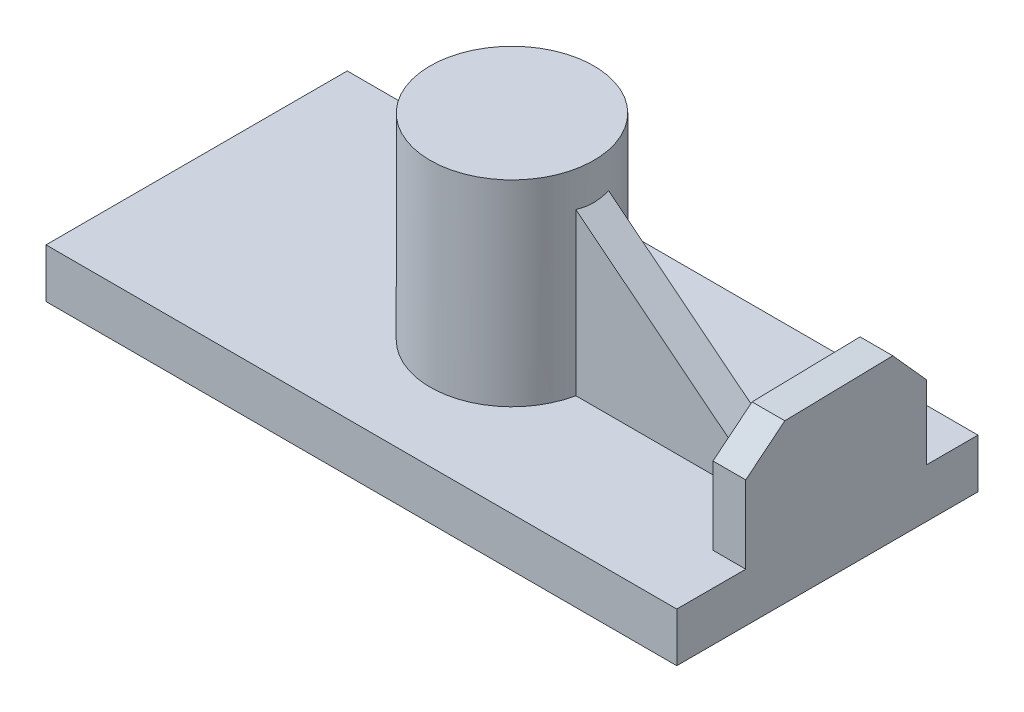
ISO-10303-21;
HEADER;
FILE_DESCRIPTION(('STEP AP214'),'2;1');
FILE_NAME('part.step','',(''),(''),'','','');
FILE_SCHEMA(('AUTOMOTIVE_DESIGN { 1 0 10303 214 1 1 1 1 }'));
ENDSEC;
DATA;
#1=APPLICATION_CONTEXT('core data for automotive mechanical design processes');
#2=APPLICATION_PROTOCOL_DEFINITION('international standard','automotive_design',2000,#1);
#3=PRODUCT_CONTEXT('',#1,'mechanical');
#4=PRODUCT('Part','Part','',(#3));
#5=PRODUCT_RELATED_PRODUCT_CATEGORY('part','',(#4));
#6=PRODUCT_DEFINITION_FORMATION('','',#4);
#7=PRODUCT_DEFINITION_CONTEXT('part definition',#1,'design');
#8=PRODUCT_DEFINITION('design','',#6,#7);
#9=PRODUCT_DEFINITION_SHAPE('','',#8);
#10=(LENGTH_UNIT() NAMED_UNIT(*) SI_UNIT(.MILLI.,.METRE.));
#11=(NAMED_UNIT(*) PLANE_ANGLE_UNIT() SI_UNIT($,.RADIAN.));
#12=(NAMED_UNIT(*) SI_UNIT($,.STERADIAN.) SOLID_ANGLE_UNIT());
#13=UNCERTAINTY_MEASURE_WITH_UNIT(LENGTH_MEASURE(1.E-05),#10,'distance_accuracy_value','');
#14=(GEOMETRIC_REPRESENTATION_CONTEXT(3) GLOBAL_UNCERTAINTY_ASSIGNED_CONTEXT((#13)) GLOBAL_UNIT_ASSIGNED_CONTEXT((#10,
#11,#12)) REPRESENTATION_CONTEXT('',''));
#15=CARTESIAN_POINT('',(0.,0.,0.));
#16=DIRECTION('',(0.,0.,1.));
#17=DIRECTION('',(1.,0.,0.));
#18=AXIS2_PLACEMENT_3D('',#15,#16,#17);
#19=CARTESIAN_POINT('',(96.3076157771806,15.,45.9944443061423));
#20=DIRECTION('',(-1.,0.,0.));
#21=DIRECTION('',(0.,0.,1.));
#22=AXIS2_PLACEMENT_3D('',#19,#20,#21);
#23=PLANE('',#22);
#24=DIRECTION('',(0.,0.,-1.));
#25=VECTOR('',#24,1.);
#26=CARTESIAN_POINT('',(96.3076157771806,0.,45.9944443061423));
#27=LINE('',#26,#25);
#28=CARTESIAN_POINT('',(96.3076157771806,0.,45.9944443061423));
#29=VERTEX_POINT('',#28);
#30=CARTESIAN_POINT('',(96.3076157771806,0.,-45.9944443061423));
#31=VERTEX_POINT('',#30);
#32=EDGE_CURVE('E242',#29,#31,#27,.T.);
#33=ORIENTED_EDGE('',*,*,#32,.T.);
#34=DIRECTION('',(0.,-1.,0.));
#35=VECTOR('',#34,1.);
#36=CARTESIAN_POINT('',(96.3076157771806,15.,-45.9944443061423));
#37=LINE('',#36,#35);
#38=CARTESIAN_POINT('',(96.3076157771806,15.,-45.9944443061423));
#39=VERTEX_POINT('',#38);
#40=EDGE_CURVE('E42',#39,#31,#37,.T.);
#41=ORIENTED_EDGE('',*,*,#40,.F.);
#42=DIRECTION('',(0.,0.,-1.));
#43=VECTOR('',#42,1.);
#44=CARTESIAN_POINT('',(96.3076157771806,15.,45.9944443061423));
#45=LINE('',#44,#43);
#46=CARTESIAN_POINT('',(96.3076157771806,15.,-30.2241424764561));
#47=VERTEX_POINT('',#46);
#48=EDGE_CURVE('E248',#47,#39,#45,.T.);
#49=ORIENTED_EDGE('',*,*,#48,.F.);
#50=DIRECTION('',(0.,1.,0.));
#51=VECTOR('',#50,1.);
#52=CARTESIAN_POINT('',(96.3076157771806,15.,-30.2241424764561));
#53=LINE('',#52,#51);
#54=CARTESIAN_POINT('',(96.3076157771806,37.5508840274022,-30.2241424764561));
#55=VERTEX_POINT('',#54);
#56=EDGE_CURVE('E206',#47,#55,#53,.T.);
#57=ORIENTED_EDGE('',*,*,#56,.T.);
#58=DIRECTION('',(0.,0.74493663179056,0.667135229632296));
#59=VECTOR('',#58,1.);
#60=CARTESIAN_POINT('',(96.3076157771806,37.5508840274022,-30.2241424764561));
#61=LINE('',#60,#59);
#62=CARTESIAN_POINT('',(96.3076157771806,48.9901265701462,-19.9796178083247));
#63=VERTEX_POINT('',#62);
#64=EDGE_CURVE('E210',#55,#63,#61,.T.);
#65=ORIENTED_EDGE('',*,*,#64,.T.);
#66=DIRECTION('',(0.,-0.021472129193453,0.999769447256666));
#67=VECTOR('',#66,1.);
#68=CARTESIAN_POINT('',(96.3076157771806,48.9901265701462,-19.9796178083247));
#69=LINE('',#68,#67);
#70=CARTESIAN_POINT('',(96.3076157771806,48.2818845377864,12.9970254875929));
#71=VERTEX_POINT('',#70);
#72=EDGE_CURVE('E214',#63,#71,#69,.T.);
#73=ORIENTED_EDGE('',*,*,#72,.T.);
#74=DIRECTION('',(0.,-0.629335820061326,0.777133467036222));
#75=VECTOR('',#74,1.);
#76=CARTESIAN_POINT('',(96.3076157771806,48.2818845377864,12.9970254875929));
#77=LINE('',#76,#75);
#78=CARTESIAN_POINT('',(96.3076157771806,38.6178073810299,24.9306824432765));
#79=VERTEX_POINT('',#78);
#80=EDGE_CURVE('E185',#71,#79,#77,.T.);
#81=ORIENTED_EDGE('',*,*,#80,.T.);
#82=DIRECTION('',(0.,-1.,0.));
#83=VECTOR('',#82,1.);
#84=CARTESIAN_POINT('',(96.3076157771806,15.,24.9306824432765));
#85=LINE('',#84,#83);
#86=CARTESIAN_POINT('',(96.3076157771806,15.,24.9306824432765));
#87=VERTEX_POINT('',#86);
#88=EDGE_CURVE('E182',#79,#87,#85,.T.);
#89=ORIENTED_EDGE('',*,*,#88,.T.);
#90=CARTESIAN_POINT('',(96.3076157771806,15.,45.9944443061423));
#91=VERTEX_POINT('',#90);
#92=EDGE_CURVE('E244',#91,#87,#45,.T.);
#93=ORIENTED_EDGE('',*,*,#92,.F.);
#94=DIRECTION('',(0.,-1.,0.));
#95=VECTOR('',#94,1.);
#96=CARTESIAN_POINT('',(96.3076157771806,15.,45.9944443061423));
#97=LINE('',#96,#95);
#98=EDGE_CURVE('E257',#91,#29,#97,.T.);
#99=ORIENTED_EDGE('',*,*,#98,.T.);
#100=EDGE_LOOP('',(#33,#41,#49,#57,#65,#73,#81,#89,#93,#99));
#101=FACE_BOUND('',#100,.T.);
#102=ADVANCED_FACE('F39',(#101),#23,.F.);
#103=CARTESIAN_POINT('',(-96.3076157771806,15.,-45.9944443061423));
#104=DIRECTION('',(0.,0.,1.));
#105=DIRECTION('',(1.,0.,0.));
#106=AXIS2_PLACEMENT_3D('',#103,#104,#105);
#107=PLANE('',#106);
#108=DIRECTION('',(-1.,0.,0.));
#109=VECTOR('',#108,1.);
#110=CARTESIAN_POINT('',(-96.3076157771806,0.,-45.9944443061423));
#111=LINE('',#110,#109);
#112=CARTESIAN_POINT('',(-96.3076157771806,0.,-45.9944443061423));
#113=VERTEX_POINT('',#112);
#114=EDGE_CURVE('E260',#31,#113,#111,.T.);
#115=ORIENTED_EDGE('',*,*,#114,.T.);
#116=DIRECTION('',(0.,-1.,0.));
#117=VECTOR('',#116,1.);
#118=CARTESIAN_POINT('',(-96.3076157771806,15.,-45.9944443061423));
#119=LINE('',#118,#117);
#120=CARTESIAN_POINT('',(-96.3076157771806,15.,-45.9944443061423));
#121=VERTEX_POINT('',#120);
#122=EDGE_CURVE('E275',#121,#113,#119,.T.);
#123=ORIENTED_EDGE('',*,*,#122,.F.);
#124=DIRECTION('',(-1.,0.,0.));
#125=VECTOR('',#124,1.);
#126=CARTESIAN_POINT('',(-96.3076157771806,15.,-45.9944443061423));
#127=LINE('',#126,#125);
#128=EDGE_CURVE('E247',#39,#121,#127,.T.);
#129=ORIENTED_EDGE('',*,*,#128,.F.);
#130=ORIENTED_EDGE('',*,*,#40,.T.);
#131=EDGE_LOOP('',(#115,#123,#129,#130));
#132=FACE_BOUND('',#131,.T.);
#133=ADVANCED_FACE('F287',(#132),#107,.F.);
#134=CARTESIAN_POINT('',(-96.3076157771806,15.,45.9944443061423));
#135=DIRECTION('',(1.,0.,0.));
#136=DIRECTION('',(0.,0.,-1.));
#137=AXIS2_PLACEMENT_3D('',#134,#135,#136);
#138=PLANE('',#137);
#139=DIRECTION('',(0.,-1.,0.));
#140=VECTOR('',#139,1.);
#141=CARTESIAN_POINT('',(-96.3076157771806,15.,45.9944443061423));
#142=LINE('',#141,#140);
#143=CARTESIAN_POINT('',(-96.3076157771806,15.,45.9944443061423));
#144=VERTEX_POINT('',#143);
#145=CARTESIAN_POINT('',(-96.3076157771806,0.,45.9944443061423));
#146=VERTEX_POINT('',#145);
#147=EDGE_CURVE('E272',#144,#146,#142,.T.);
#148=ORIENTED_EDGE('',*,*,#147,.F.);
#149=DIRECTION('',(0.,0.,1.));
#150=VECTOR('',#149,1.);
#151=CARTESIAN_POINT('',(-96.3076157771806,15.,45.9944443061423));
#152=LINE('',#151,#150);
#153=EDGE_CURVE('E251',#121,#144,#152,.T.);
#154=ORIENTED_EDGE('',*,*,#153,.F.);
#155=ORIENTED_EDGE('',*,*,#122,.T.);
#156=DIRECTION('',(0.,0.,1.));
#157=VECTOR('',#156,1.);
#158=CARTESIAN_POINT('',(-96.3076157771806,0.,45.9944443061423));
#159=LINE('',#158,#157);
#160=EDGE_CURVE('E263',#113,#146,#159,.T.);
#161=ORIENTED_EDGE('',*,*,#160,.T.);
#162=EDGE_LOOP('',(#148,#154,#155,#161));
#163=FACE_BOUND('',#162,.T.);
#164=ADVANCED_FACE('F297',(#163),#138,.F.);
#165=CARTESIAN_POINT('',(-96.3076157771806,15.,45.9944443061423));
#166=DIRECTION('',(0.,0.,-1.));
#167=DIRECTION('',(-1.,0.,0.));
#168=AXIS2_PLACEMENT_3D('',#165,#166,#167);
#169=PLANE('',#168);
#170=DIRECTION('',(1.,0.,0.));
#171=VECTOR('',#170,1.);
#172=CARTESIAN_POINT('',(-96.3076157771806,0.,45.9944443061423));
#173=LINE('',#172,#171);
#174=EDGE_CURVE('E266',#146,#29,#173,.T.);
#175=ORIENTED_EDGE('',*,*,#174,.T.);
#176=ORIENTED_EDGE('',*,*,#98,.F.);
#177=DIRECTION('',(1.,0.,0.));
#178=VECTOR('',#177,1.);
#179=CARTESIAN_POINT('',(-96.3076157771806,15.,45.9944443061423));
#180=LINE('',#179,#178);
#181=EDGE_CURVE('E254',#144,#91,#180,.T.);
#182=ORIENTED_EDGE('',*,*,#181,.F.);
#183=ORIENTED_EDGE('',*,*,#147,.T.);
#184=EDGE_LOOP('',(#175,#176,#182,#183));
#185=FACE_BOUND('',#184,.T.);
#186=ADVANCED_FACE('F300',(#185),#169,.F.);
#187=CARTESIAN_POINT('',(0.,15.,0.));
#188=DIRECTION('',(0.,-1.,0.));
#189=DIRECTION('',(0.,0.,-1.));
#190=AXIS2_PLACEMENT_3D('',#187,#188,#189);
#191=PLANE('',#190);
#192=DIRECTION('',(0.,0.,-1.));
#193=VECTOR('',#192,1.);
#194=CARTESIAN_POINT('',(86.3076157771806,15.,24.9306824432765));
#195=LINE('',#194,#193);
#196=CARTESIAN_POINT('',(86.3076157771806,15.,24.9306824432765));
#197=VERTEX_POINT('',#196);
#198=CARTESIAN_POINT('',(86.3076157771806,15.,5.));
#199=VERTEX_POINT('',#198);
#200=EDGE_CURVE('E148',#197,#199,#195,.T.);
#201=ORIENTED_EDGE('',*,*,#200,.T.);
#202=DIRECTION('',(-1.,0.,0.));
#203=VECTOR('',#202,1.);
#204=CARTESIAN_POINT('',(0.,15.,5.));
#205=LINE('',#204,#203);
#206=CARTESIAN_POINT('',(24.4948974278318,15.,5.));
#207=VERTEX_POINT('',#206);
#208=EDGE_CURVE('E175',#199,#207,#205,.T.);
#209=ORIENTED_EDGE('',*,*,#208,.T.);
#210=CARTESIAN_POINT('',(0.,15.,0.));
#211=DIRECTION('',(0.,1.,0.));
#212=DIRECTION('',(0.,0.,1.));
#213=AXIS2_PLACEMENT_3D('',#210,#211,#212);
#214=CIRCLE('',#213,25.);
#215=CARTESIAN_POINT('',(24.4948974278318,15.,-5.));
#216=VERTEX_POINT('',#215);
#217=EDGE_CURVE('E11',#216,#207,#214,.T.);
#218=ORIENTED_EDGE('',*,*,#217,.F.);
#219=DIRECTION('',(-1.,0.,0.));
#220=VECTOR('',#219,1.);
#221=CARTESIAN_POINT('',(0.,15.,-5.));
#222=LINE('',#221,#220);
#223=CARTESIAN_POINT('',(86.3076157771806,15.,-5.));
#224=VERTEX_POINT('',#223);
#225=EDGE_CURVE('E151',#224,#216,#222,.T.);
#226=ORIENTED_EDGE('',*,*,#225,.F.);
#227=CARTESIAN_POINT('',(86.3076157771806,15.,-30.2241424764561));
#228=VERTEX_POINT('',#227);
#229=EDGE_CURVE('E131',#224,#228,#195,.T.);
#230=ORIENTED_EDGE('',*,*,#229,.T.);
#231=DIRECTION('',(1.,0.,0.));
#232=VECTOR('',#231,1.);
#233=CARTESIAN_POINT('',(86.3076157771806,15.,-30.2241424764561));
#234=LINE('',#233,#232);
#235=EDGE_CURVE('E234',#228,#47,#234,.T.);
#236=ORIENTED_EDGE('',*,*,#235,.T.);
#237=ORIENTED_EDGE('',*,*,#48,.T.);
#238=ORIENTED_EDGE('',*,*,#128,.T.);
#239=ORIENTED_EDGE('',*,*,#153,.T.);
#240=ORIENTED_EDGE('',*,*,#181,.T.);
#241=ORIENTED_EDGE('',*,*,#92,.T.);
#242=DIRECTION('',(1.,0.,0.));
#243=VECTOR('',#242,1.);
#244=CARTESIAN_POINT('',(86.3076157771806,15.,24.9306824432765));
#245=LINE('',#244,#243);
#246=EDGE_CURVE('E202',#197,#87,#245,.T.);
#247=ORIENTED_EDGE('',*,*,#246,.F.);
#248=EDGE_LOOP('',(#201,#209,#218,#226,#230,#236,#237,#238,#239,#240,#241,#247));
#249=FACE_BOUND('',#248,.T.);
#250=ADVANCED_FACE('F152',(#249),#191,.F.);
#251=CARTESIAN_POINT('',(0.,0.,0.));
#252=DIRECTION('',(0.,-1.,0.));
#253=DIRECTION('',(0.,0.,-1.));
#254=AXIS2_PLACEMENT_3D('',#251,#252,#253);
#255=PLANE('',#254);
#256=ORIENTED_EDGE('',*,*,#174,.F.);
#257=ORIENTED_EDGE('',*,*,#160,.F.);
#258=ORIENTED_EDGE('',*,*,#114,.F.);
#259=ORIENTED_EDGE('',*,*,#32,.F.);
#260=EDGE_LOOP('',(#256,#257,#258,#259));
#261=FACE_BOUND('',#260,.T.);
#262=ADVANCED_FACE('F295',(#261),#255,.T.);
#263=CARTESIAN_POINT('',(0.,75.,0.));
#264=DIRECTION('',(0.,-1.,0.));
#265=DIRECTION('',(0.,0.,-1.));
#266=AXIS2_PLACEMENT_3D('',#263,#264,#265);
#267=CYLINDRICAL_SURFACE('',#266,25.);
#268=ORIENTED_EDGE('',*,*,#217,.T.);
#269=DIRECTION('',(0.,-1.,0.));
#270=VECTOR('',#269,1.);
#271=CARTESIAN_POINT('',(24.4948974278318,75.,5.));
#272=LINE('',#271,#270);
#273=CARTESIAN_POINT('',(24.4948974278318,64.2472318628471,5.));
#274=VERTEX_POINT('',#273);
#275=EDGE_CURVE('E54',#207,#274,#272,.F.);
#276=ORIENTED_EDGE('',*,*,#275,.T.);
#277=CARTESIAN_POINT('',(0.,83.7627284353707,0.));
#278=DIRECTION('',(-0.623128031337589,-0.782119847952564,0.));
#279=DIRECTION('',(0.782119847952563,-0.623128031337589,0.));
#280=AXIS2_PLACEMENT_3D('',#277,#278,#279);
#281=ELLIPSE('',#280,31.9644106532331,25.);
#282=CARTESIAN_POINT('',(24.4948974278318,64.2472318628471,-5.));
#283=VERTEX_POINT('',#282);
#284=EDGE_CURVE('E58',#274,#283,#281,.F.);
#285=ORIENTED_EDGE('',*,*,#284,.T.);
#286=DIRECTION('',(0.,-1.,0.));
#287=VECTOR('',#286,1.);
#288=CARTESIAN_POINT('',(24.4948974278318,75.,-5.));
#289=LINE('',#288,#287);
#290=EDGE_CURVE('E157',#216,#283,#289,.F.);
#291=ORIENTED_EDGE('',*,*,#290,.F.);
#292=EDGE_LOOP('',(#268,#276,#285,#291));
#293=FACE_BOUND('',#292,.T.);
#294=CARTESIAN_POINT('',(0.,75.,0.));
#295=DIRECTION('',(0.,1.,0.));
#296=DIRECTION('',(0.,0.,1.));
#297=AXIS2_PLACEMENT_3D('',#294,#295,#296);
#298=CIRCLE('',#297,25.);
#299=CARTESIAN_POINT('',(0.,75.,25.));
#300=VERTEX_POINT('',#299);
#301=EDGE_CURVE('E224',#300,#300,#298,.T.);
#302=ORIENTED_EDGE('',*,*,#301,.F.);
#303=EDGE_LOOP('',(#302));
#304=FACE_BOUND('',#303,.T.);
#305=ADVANCED_FACE('F343',(#293,#304),#267,.T.);
#306=CARTESIAN_POINT('',(0.,75.,0.));
#307=DIRECTION('',(0.,1.,0.));
#308=DIRECTION('',(0.,0.,1.));
#309=AXIS2_PLACEMENT_3D('',#306,#307,#308);
#310=PLANE('',#309);
#311=ORIENTED_EDGE('',*,*,#301,.T.);
#312=EDGE_LOOP('',(#311));
#313=FACE_BOUND('',#312,.T.);
#314=ADVANCED_FACE('F348',(#313),#310,.T.);
#315=CARTESIAN_POINT('',(86.3076157771806,15.,24.9306824432765));
#316=DIRECTION('',(0.,0.,1.));
#317=DIRECTION('',(1.,0.,0.));
#318=AXIS2_PLACEMENT_3D('',#315,#316,#317);
#319=PLANE('',#318);
#320=ORIENTED_EDGE('',*,*,#88,.F.);
#321=DIRECTION('',(1.,0.,0.));
#322=VECTOR('',#321,1.);
#323=CARTESIAN_POINT('',(86.3076157771806,38.6178073810299,24.9306824432765));
#324=LINE('',#323,#322);
#325=CARTESIAN_POINT('',(86.3076157771806,38.6178073810299,24.9306824432765));
#326=VERTEX_POINT('',#325);
#327=EDGE_CURVE('E221',#326,#79,#324,.T.);
#328=ORIENTED_EDGE('',*,*,#327,.F.);
#329=DIRECTION('',(0.,-1.,0.));
#330=VECTOR('',#329,1.);
#331=CARTESIAN_POINT('',(86.3076157771806,15.,24.9306824432765));
#332=LINE('',#331,#330);
#333=EDGE_CURVE('E146',#326,#197,#332,.T.);
#334=ORIENTED_EDGE('',*,*,#333,.T.);
#335=ORIENTED_EDGE('',*,*,#246,.T.);
#336=EDGE_LOOP('',(#320,#328,#334,#335));
#337=FACE_BOUND('',#336,.T.);
#338=ADVANCED_FACE('F318',(#337),#319,.T.);
#339=CARTESIAN_POINT('',(86.3076157771806,48.2818845377864,12.9970254875929));
#340=DIRECTION('',(0.,0.777133467036222,0.629335820061326));
#341=DIRECTION('',(0.,-0.629335820061326,0.777133467036222));
#342=AXIS2_PLACEMENT_3D('',#339,#340,#341);
#343=PLANE('',#342);
#344=ORIENTED_EDGE('',*,*,#80,.F.);
#345=DIRECTION('',(1.,0.,0.));
#346=VECTOR('',#345,1.);
#347=CARTESIAN_POINT('',(86.3076157771806,48.2818845377864,12.9970254875929));
#348=LINE('',#347,#346);
#349=CARTESIAN_POINT('',(86.3076157771806,48.2818845377864,12.9970254875929));
#350=VERTEX_POINT('',#349);
#351=EDGE_CURVE('E225',#350,#71,#348,.T.);
#352=ORIENTED_EDGE('',*,*,#351,.F.);
#353=DIRECTION('',(0.,-0.629335820061326,0.777133467036222));
#354=VECTOR('',#353,1.);
#355=CARTESIAN_POINT('',(86.3076157771806,48.2818845377864,12.9970254875929));
#356=LINE('',#355,#354);
#357=EDGE_CURVE('E198',#350,#326,#356,.T.);
#358=ORIENTED_EDGE('',*,*,#357,.T.);
#359=ORIENTED_EDGE('',*,*,#327,.T.);
#360=EDGE_LOOP('',(#344,#352,#358,#359));
#361=FACE_BOUND('',#360,.T.);
#362=ADVANCED_FACE('F315',(#361),#343,.T.);
#363=CARTESIAN_POINT('',(86.3076157771806,48.9901265701462,-19.9796178083247));
#364=DIRECTION('',(0.,0.999769447256666,0.021472129193453));
#365=DIRECTION('',(0.,-0.021472129193453,0.999769447256666));
#366=AXIS2_PLACEMENT_3D('',#363,#364,#365);
#367=PLANE('',#366);
#368=ORIENTED_EDGE('',*,*,#72,.F.);
#369=DIRECTION('',(1.,0.,0.));
#370=VECTOR('',#369,1.);
#371=CARTESIAN_POINT('',(86.3076157771806,48.9901265701462,-19.9796178083247));
#372=LINE('',#371,#370);
#373=CARTESIAN_POINT('',(86.3076157771806,48.9901265701462,-19.9796178083247));
#374=VERTEX_POINT('',#373);
#375=EDGE_CURVE('E228',#374,#63,#372,.T.);
#376=ORIENTED_EDGE('',*,*,#375,.F.);
#377=DIRECTION('',(0.,-0.021472129193453,0.999769447256666));
#378=VECTOR('',#377,1.);
#379=CARTESIAN_POINT('',(86.3076157771806,48.9901265701462,-19.9796178083247));
#380=LINE('',#379,#378);
#381=EDGE_CURVE('E194',#374,#350,#380,.T.);
#382=ORIENTED_EDGE('',*,*,#381,.T.);
#383=ORIENTED_EDGE('',*,*,#351,.T.);
#384=EDGE_LOOP('',(#368,#376,#382,#383));
#385=FACE_BOUND('',#384,.T.);
#386=ADVANCED_FACE('F312',(#385),#367,.T.);
#387=CARTESIAN_POINT('',(86.3076157771806,37.5508840274022,-30.2241424764561));
#388=DIRECTION('',(0.,0.667135229632296,-0.74493663179056));
#389=DIRECTION('',(0.,0.74493663179056,0.667135229632296));
#390=AXIS2_PLACEMENT_3D('',#387,#388,#389);
#391=PLANE('',#390);
#392=ORIENTED_EDGE('',*,*,#64,.F.);
#393=DIRECTION('',(1.,0.,0.));
#394=VECTOR('',#393,1.);
#395=CARTESIAN_POINT('',(86.3076157771806,37.5508840274022,-30.2241424764561));
#396=LINE('',#395,#394);
#397=CARTESIAN_POINT('',(86.3076157771806,37.5508840274022,-30.2241424764561));
#398=VERTEX_POINT('',#397);
#399=EDGE_CURVE('E231',#398,#55,#396,.T.);
#400=ORIENTED_EDGE('',*,*,#399,.F.);
#401=DIRECTION('',(0.,0.74493663179056,0.667135229632296));
#402=VECTOR('',#401,1.);
#403=CARTESIAN_POINT('',(86.3076157771806,37.5508840274022,-30.2241424764561));
#404=LINE('',#403,#402);
#405=EDGE_CURVE('E190',#398,#374,#404,.T.);
#406=ORIENTED_EDGE('',*,*,#405,.T.);
#407=ORIENTED_EDGE('',*,*,#375,.T.);
#408=EDGE_LOOP('',(#392,#400,#406,#407));
#409=FACE_BOUND('',#408,.T.);
#410=ADVANCED_FACE('F309',(#409),#391,.T.);
#411=CARTESIAN_POINT('',(86.3076157771806,15.,-30.2241424764561));
#412=DIRECTION('',(0.,0.,-1.));
#413=DIRECTION('',(-1.,0.,0.));
#414=AXIS2_PLACEMENT_3D('',#411,#412,#413);
#415=PLANE('',#414);
#416=ORIENTED_EDGE('',*,*,#56,.F.);
#417=ORIENTED_EDGE('',*,*,#235,.F.);
#418=DIRECTION('',(0.,1.,0.));
#419=VECTOR('',#418,1.);
#420=CARTESIAN_POINT('',(86.3076157771806,15.,-30.2241424764561));
#421=LINE('',#420,#419);
#422=EDGE_CURVE('E141',#228,#398,#421,.T.);
#423=ORIENTED_EDGE('',*,*,#422,.T.);
#424=ORIENTED_EDGE('',*,*,#399,.T.);
#425=EDGE_LOOP('',(#416,#417,#423,#424));
#426=FACE_BOUND('',#425,.T.);
#427=ADVANCED_FACE('F304',(#426),#415,.T.);
#428=CARTESIAN_POINT('',(86.3076157771806,0.,0.));
#429=DIRECTION('',(-1.,0.,0.));
#430=DIRECTION('',(0.,0.,1.));
#431=AXIS2_PLACEMENT_3D('',#428,#429,#430);
#432=PLANE('',#431);
#433=ORIENTED_EDGE('',*,*,#333,.F.);
#434=ORIENTED_EDGE('',*,*,#357,.F.);
#435=ORIENTED_EDGE('',*,*,#381,.F.);
#436=ORIENTED_EDGE('',*,*,#405,.F.);
#437=ORIENTED_EDGE('',*,*,#422,.F.);
#438=ORIENTED_EDGE('',*,*,#229,.F.);
#439=EDGE_CURVE('E137',#199,#224,#195,.T.);
#440=ORIENTED_EDGE('',*,*,#439,.F.);
#441=ORIENTED_EDGE('',*,*,#200,.F.);
#442=EDGE_LOOP('',(#433,#434,#435,#436,#437,#438,#440,#441));
#443=FACE_BOUND('',#442,.T.);
#444=ADVANCED_FACE('F134',(#443),#432,.T.);
#445=CARTESIAN_POINT('',(25.4723028442951,63.4685165360671,0.));
#446=DIRECTION('',(-0.623128031337589,-0.782119847952564,0.));
#447=DIRECTION('',(0.782119847952563,-0.623128031337589,0.));
#448=AXIS2_PLACEMENT_3D('',#445,#446,#447);
#449=PLANE('',#448);
#450=ORIENTED_EDGE('',*,*,#284,.F.);
#451=DIRECTION('',(0.782119847952563,-0.623128031337589,0.));
#452=VECTOR('',#451,1.);
#453=CARTESIAN_POINT('',(25.4723028442951,63.4685165360671,5.));
#454=LINE('',#453,#452);
#455=EDGE_CURVE('E165',#274,#199,#454,.T.);
#456=ORIENTED_EDGE('',*,*,#455,.T.);
#457=ORIENTED_EDGE('',*,*,#439,.T.);
#458=DIRECTION('',(0.782119847952563,-0.623128031337589,0.));
#459=VECTOR('',#458,1.);
#460=CARTESIAN_POINT('',(25.4723028442951,63.4685165360671,-5.));
#461=LINE('',#460,#459);
#462=EDGE_CURVE('E163',#283,#224,#461,.T.);
#463=ORIENTED_EDGE('',*,*,#462,.F.);
#464=EDGE_LOOP('',(#450,#456,#457,#463));
#465=FACE_BOUND('',#464,.T.);
#466=ADVANCED_FACE('F162',(#465),#449,.F.);
#467=CARTESIAN_POINT('',(0.,37.5,5.));
#468=DIRECTION('',(0.,0.,1.));
#469=DIRECTION('',(1.,0.,0.));
#470=AXIS2_PLACEMENT_3D('',#467,#468,#469);
#471=PLANE('',#470);
#472=ORIENTED_EDGE('',*,*,#208,.F.);
#473=ORIENTED_EDGE('',*,*,#455,.F.);
#474=ORIENTED_EDGE('',*,*,#275,.F.);
#475=EDGE_LOOP('',(#472,#473,#474));
#476=FACE_BOUND('',#475,.T.);
#477=ADVANCED_FACE('F321',(#476),#471,.T.);
#478=CARTESIAN_POINT('',(0.,37.5,-5.));
#479=DIRECTION('',(0.,0.,1.));
#480=DIRECTION('',(1.,0.,0.));
#481=AXIS2_PLACEMENT_3D('',#478,#479,#480);
#482=PLANE('',#481);
#483=ORIENTED_EDGE('',*,*,#462,.T.);
#484=ORIENTED_EDGE('',*,*,#225,.T.);
#485=ORIENTED_EDGE('',*,*,#290,.T.);
#486=EDGE_LOOP('',(#483,#484,#485));
#487=FACE_BOUND('',#486,.T.);
#488=ADVANCED_FACE('F167',(#487),#482,.F.);
#489=CLOSED_SHELL('',(#102,#133,#164,#186,#250,#262,#305,#314,#338,#362,#386,#410,#427,#444,
#466,#477,#488));
#490=MANIFOLD_SOLID_BREP('B2',#489);
#491=ADVANCED_BREP_SHAPE_REPRESENTATION('',(#18,#490),#14);
#492=SHAPE_DEFINITION_REPRESENTATION(#9,#491);
ENDSEC;
END-ISO-10303-21;
